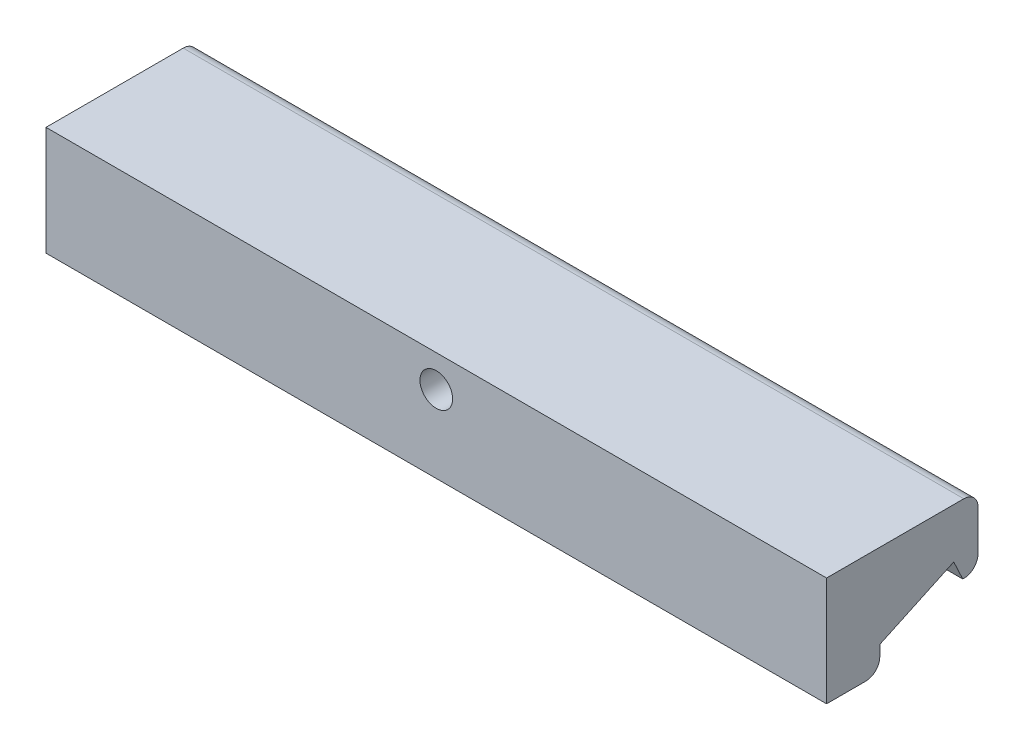
ISO-10303-21;
HEADER;
FILE_DESCRIPTION(('STEP AP214'),'2;1');
FILE_NAME('part.step','',(''),(''),'','','');
FILE_SCHEMA(('AUTOMOTIVE_DESIGN { 1 0 10303 214 1 1 1 1 }'));
ENDSEC;
DATA;
#1=APPLICATION_CONTEXT('core data for automotive mechanical design processes');
#2=APPLICATION_PROTOCOL_DEFINITION('international standard','automotive_design',2000,#1);
#3=PRODUCT_CONTEXT('',#1,'mechanical');
#4=PRODUCT('Part','Part','',(#3));
#5=PRODUCT_RELATED_PRODUCT_CATEGORY('part','',(#4));
#6=PRODUCT_DEFINITION_FORMATION('','',#4);
#7=PRODUCT_DEFINITION_CONTEXT('part definition',#1,'design');
#8=PRODUCT_DEFINITION('design','',#6,#7);
#9=PRODUCT_DEFINITION_SHAPE('','',#8);
#10=(LENGTH_UNIT() NAMED_UNIT(*) SI_UNIT(.MILLI.,.METRE.));
#11=(NAMED_UNIT(*) PLANE_ANGLE_UNIT() SI_UNIT($,.RADIAN.));
#12=(NAMED_UNIT(*) SI_UNIT($,.STERADIAN.) SOLID_ANGLE_UNIT());
#13=UNCERTAINTY_MEASURE_WITH_UNIT(LENGTH_MEASURE(1.E-05),#10,'distance_accuracy_value','');
#14=(GEOMETRIC_REPRESENTATION_CONTEXT(3) GLOBAL_UNCERTAINTY_ASSIGNED_CONTEXT((#13)) GLOBAL_UNIT_ASSIGNED_CONTEXT((#10,
#11,#12)) REPRESENTATION_CONTEXT('',''));
#15=CARTESIAN_POINT('',(0.,0.,0.));
#16=DIRECTION('',(0.,0.,1.));
#17=DIRECTION('',(1.,0.,0.));
#18=AXIS2_PLACEMENT_3D('',#15,#16,#17);
#19=CARTESIAN_POINT('',(110.,15.360110010018,0.));
#20=DIRECTION('',(0.,0.,-1.));
#21=DIRECTION('',(0.,1.,0.));
#22=AXIS2_PLACEMENT_3D('',#19,#20,#21);
#23=PLANE('',#22);
#24=CARTESIAN_POINT('',(55.,10.860110010018,0.));
#25=DIRECTION('',(0.,0.,1.));
#26=DIRECTION('',(1.,0.,0.));
#27=AXIS2_PLACEMENT_3D('',#24,#25,#26);
#28=CIRCLE('',#27,2.3);
#29=CARTESIAN_POINT('',(57.3,10.860110010018,0.));
#30=VERTEX_POINT('',#29);
#31=EDGE_CURVE('E213',#30,#30,#28,.T.);
#32=ORIENTED_EDGE('',*,*,#31,.F.);
#33=EDGE_LOOP('',(#32));
#34=FACE_BOUND('',#33,.T.);
#35=DIRECTION('',(0.,-1.,0.));
#36=VECTOR('',#35,1.);
#37=CARTESIAN_POINT('',(0.,15.360110010018,0.));
#38=LINE('',#37,#36);
#39=CARTESIAN_POINT('',(0.,15.360110010018,0.));
#40=VERTEX_POINT('',#39);
#41=CARTESIAN_POINT('',(0.,0.,0.));
#42=VERTEX_POINT('',#41);
#43=EDGE_CURVE('E147',#40,#42,#38,.T.);
#44=ORIENTED_EDGE('',*,*,#43,.T.);
#45=DIRECTION('',(-1.,0.,0.));
#46=VECTOR('',#45,1.);
#47=CARTESIAN_POINT('',(110.,0.,0.));
#48=LINE('',#47,#46);
#49=CARTESIAN_POINT('',(110.,0.,0.));
#50=VERTEX_POINT('',#49);
#51=EDGE_CURVE('E11',#50,#42,#48,.T.);
#52=ORIENTED_EDGE('',*,*,#51,.F.);
#53=DIRECTION('',(0.,-1.,0.));
#54=VECTOR('',#53,1.);
#55=CARTESIAN_POINT('',(110.,15.360110010018,0.));
#56=LINE('',#55,#54);
#57=CARTESIAN_POINT('',(110.,15.360110010018,0.));
#58=VERTEX_POINT('',#57);
#59=EDGE_CURVE('E166',#58,#50,#56,.T.);
#60=ORIENTED_EDGE('',*,*,#59,.F.);
#61=DIRECTION('',(-1.,0.,0.));
#62=VECTOR('',#61,1.);
#63=CARTESIAN_POINT('',(110.,15.360110010018,0.));
#64=LINE('',#63,#62);
#65=EDGE_CURVE('E143',#58,#40,#64,.T.);
#66=ORIENTED_EDGE('',*,*,#65,.T.);
#67=EDGE_LOOP('',(#44,#52,#60,#66));
#68=FACE_BOUND('',#67,.T.);
#69=ADVANCED_FACE('F39',(#34,#68),#23,.F.);
#70=CARTESIAN_POINT('',(110.,0.,0.));
#71=DIRECTION('',(0.,1.,0.));
#72=DIRECTION('',(0.,0.,1.));
#73=AXIS2_PLACEMENT_3D('',#70,#71,#72);
#74=PLANE('',#73);
#75=DIRECTION('',(0.,0.,-1.));
#76=VECTOR('',#75,1.);
#77=CARTESIAN_POINT('',(0.,0.,0.));
#78=LINE('',#77,#76);
#79=CARTESIAN_POINT('',(0.,0.,-5.4994615533352));
#80=VERTEX_POINT('',#79);
#81=EDGE_CURVE('E150',#42,#80,#78,.T.);
#82=ORIENTED_EDGE('',*,*,#81,.T.);
#83=DIRECTION('',(-1.,0.,0.));
#84=VECTOR('',#83,1.);
#85=CARTESIAN_POINT('',(110.,0.,-5.4994615533352));
#86=LINE('',#85,#84);
#87=CARTESIAN_POINT('',(110.,0.,-5.4994615533352));
#88=VERTEX_POINT('',#87);
#89=EDGE_CURVE('E47',#88,#80,#86,.T.);
#90=ORIENTED_EDGE('',*,*,#89,.F.);
#91=DIRECTION('',(0.,0.,-1.));
#92=VECTOR('',#91,1.);
#93=CARTESIAN_POINT('',(110.,0.,0.));
#94=LINE('',#93,#92);
#95=EDGE_CURVE('E104',#50,#88,#94,.T.);
#96=ORIENTED_EDGE('',*,*,#95,.F.);
#97=ORIENTED_EDGE('',*,*,#51,.T.);
#98=EDGE_LOOP('',(#82,#90,#96,#97));
#99=FACE_BOUND('',#98,.T.);
#100=ADVANCED_FACE('F229',(#99),#74,.F.);
#101=CARTESIAN_POINT('',(110.,2.0005384466648,-5.4994615533352));
#102=DIRECTION('',(-1.,0.,0.));
#103=DIRECTION('',(0.,0.,1.));
#104=AXIS2_PLACEMENT_3D('',#101,#102,#103);
#105=CYLINDRICAL_SURFACE('',#104,2.0005384466648);
#106=CARTESIAN_POINT('',(0.,2.0005384466648,-5.4994615533352));
#107=DIRECTION('',(1.,0.,0.));
#108=DIRECTION('',(0.,0.,-1.));
#109=AXIS2_PLACEMENT_3D('',#106,#107,#108);
#110=CIRCLE('',#109,2.0005384466648);
#111=CARTESIAN_POINT('',(0.,2.0005384466648,-7.5));
#112=VERTEX_POINT('',#111);
#113=EDGE_CURVE('E153',#80,#112,#110,.T.);
#114=ORIENTED_EDGE('',*,*,#113,.T.);
#115=DIRECTION('',(-1.,0.,0.));
#116=VECTOR('',#115,1.);
#117=CARTESIAN_POINT('',(110.,2.0005384466648,-7.5));
#118=LINE('',#117,#116);
#119=CARTESIAN_POINT('',(110.,2.0005384466648,-7.5));
#120=VERTEX_POINT('',#119);
#121=EDGE_CURVE('E179',#120,#112,#118,.T.);
#122=ORIENTED_EDGE('',*,*,#121,.F.);
#123=CARTESIAN_POINT('',(110.,2.0005384466648,-5.4994615533352));
#124=DIRECTION('',(1.,0.,0.));
#125=DIRECTION('',(0.,0.,-1.));
#126=AXIS2_PLACEMENT_3D('',#123,#124,#125);
#127=CIRCLE('',#126,2.0005384466648);
#128=EDGE_CURVE('E187',#88,#120,#127,.T.);
#129=ORIENTED_EDGE('',*,*,#128,.F.);
#130=ORIENTED_EDGE('',*,*,#89,.T.);
#131=EDGE_LOOP('',(#114,#122,#129,#130));
#132=FACE_BOUND('',#131,.T.);
#133=ADVANCED_FACE('F185',(#132),#105,.T.);
#134=CARTESIAN_POINT('',(110.,3.5,-7.5));
#135=DIRECTION('',(0.,0.,1.));
#136=DIRECTION('',(0.,-1.,0.));
#137=AXIS2_PLACEMENT_3D('',#134,#135,#136);
#138=PLANE('',#137);
#139=DIRECTION('',(0.,1.,0.));
#140=VECTOR('',#139,1.);
#141=CARTESIAN_POINT('',(0.,3.5,-7.5));
#142=LINE('',#141,#140);
#143=CARTESIAN_POINT('',(0.,3.5,-7.5));
#144=VERTEX_POINT('',#143);
#145=EDGE_CURVE('E155',#112,#144,#142,.T.);
#146=ORIENTED_EDGE('',*,*,#145,.T.);
#147=DIRECTION('',(-1.,0.,0.));
#148=VECTOR('',#147,1.);
#149=CARTESIAN_POINT('',(110.,3.5,-7.5));
#150=LINE('',#149,#148);
#151=CARTESIAN_POINT('',(110.,3.5,-7.5));
#152=VERTEX_POINT('',#151);
#153=EDGE_CURVE('E176',#152,#144,#150,.T.);
#154=ORIENTED_EDGE('',*,*,#153,.F.);
#155=DIRECTION('',(0.,1.,0.));
#156=VECTOR('',#155,1.);
#157=CARTESIAN_POINT('',(110.,3.5,-7.5));
#158=LINE('',#157,#156);
#159=EDGE_CURVE('E205',#120,#152,#158,.T.);
#160=ORIENTED_EDGE('',*,*,#159,.F.);
#161=ORIENTED_EDGE('',*,*,#121,.T.);
#162=EDGE_LOOP('',(#146,#154,#160,#161));
#163=FACE_BOUND('',#162,.T.);
#164=ADVANCED_FACE('F196',(#163),#138,.F.);
#165=CARTESIAN_POINT('',(110.,8.36011001001802,-17.9225395509215));
#166=DIRECTION('',(0.,0.906307787036651,0.422618261740697));
#167=DIRECTION('',(0.,-0.422618261740697,0.906307787036651));
#168=AXIS2_PLACEMENT_3D('',#165,#166,#167);
#169=PLANE('',#168);
#170=DIRECTION('',(0.,0.422618261740697,-0.906307787036651));
#171=VECTOR('',#170,1.);
#172=CARTESIAN_POINT('',(0.,8.36011001001802,-17.9225395509215));
#173=LINE('',#172,#171);
#174=CARTESIAN_POINT('',(0.,8.36011001001802,-17.9225395509215));
#175=VERTEX_POINT('',#174);
#176=EDGE_CURVE('E157',#144,#175,#173,.T.);
#177=ORIENTED_EDGE('',*,*,#176,.T.);
#178=DIRECTION('',(-1.,0.,0.));
#179=VECTOR('',#178,1.);
#180=CARTESIAN_POINT('',(110.,8.36011001001802,-17.9225395509215));
#181=LINE('',#180,#179);
#182=CARTESIAN_POINT('',(110.,8.36011001001802,-17.9225395509215));
#183=VERTEX_POINT('',#182);
#184=EDGE_CURVE('E173',#183,#175,#181,.T.);
#185=ORIENTED_EDGE('',*,*,#184,.F.);
#186=DIRECTION('',(0.,0.422618261740697,-0.906307787036651));
#187=VECTOR('',#186,1.);
#188=CARTESIAN_POINT('',(110.,8.36011001001802,-17.9225395509215));
#189=LINE('',#188,#187);
#190=EDGE_CURVE('E202',#152,#183,#189,.T.);
#191=ORIENTED_EDGE('',*,*,#190,.F.);
#192=ORIENTED_EDGE('',*,*,#153,.T.);
#193=EDGE_LOOP('',(#177,#185,#191,#192));
#194=FACE_BOUND('',#193,.T.);
#195=ADVANCED_FACE('F200',(#194),#169,.F.);
#196=CARTESIAN_POINT('',(110.,5.64118664890806,-19.1903943361436));
#197=DIRECTION('',(0.,0.422618261740697,-0.906307787036651));
#198=DIRECTION('',(0.,0.906307787036651,0.422618261740697));
#199=AXIS2_PLACEMENT_3D('',#196,#197,#198);
#200=PLANE('',#199);
#201=DIRECTION('',(0.,-0.906307787036651,-0.422618261740697));
#202=VECTOR('',#201,1.);
#203=CARTESIAN_POINT('',(0.,5.64118664890806,-19.1903943361436));
#204=LINE('',#203,#202);
#205=CARTESIAN_POINT('',(0.,5.64118664890806,-19.1903943361436));
#206=VERTEX_POINT('',#205);
#207=EDGE_CURVE('E159',#175,#206,#204,.T.);
#208=ORIENTED_EDGE('',*,*,#207,.T.);
#209=DIRECTION('',(-1.,0.,0.));
#210=VECTOR('',#209,1.);
#211=CARTESIAN_POINT('',(110.,5.64118664890806,-19.1903943361436));
#212=LINE('',#211,#210);
#213=CARTESIAN_POINT('',(110.,5.64118664890806,-19.1903943361436));
#214=VERTEX_POINT('',#213);
#215=EDGE_CURVE('E170',#214,#206,#212,.T.);
#216=ORIENTED_EDGE('',*,*,#215,.F.);
#217=DIRECTION('',(0.,-0.906307787036651,-0.422618261740697));
#218=VECTOR('',#217,1.);
#219=CARTESIAN_POINT('',(110.,5.64118664890806,-19.1903943361436));
#220=LINE('',#219,#218);
#221=EDGE_CURVE('E204',#183,#214,#220,.T.);
#222=ORIENTED_EDGE('',*,*,#221,.F.);
#223=ORIENTED_EDGE('',*,*,#184,.T.);
#224=EDGE_LOOP('',(#208,#216,#222,#223));
#225=FACE_BOUND('',#224,.T.);
#226=ADVANCED_FACE('F237',(#225),#200,.F.);
#227=CARTESIAN_POINT('',(110.,7.63552847711335,-19.3407295358501));
#228=DIRECTION('',(-1.,0.,0.));
#229=DIRECTION('',(0.,0.,1.));
#230=AXIS2_PLACEMENT_3D('',#227,#228,#229);
#231=CYLINDRICAL_SURFACE('',#230,2.);
#232=CARTESIAN_POINT('',(0.,7.63552847711335,-19.3407295358501));
#233=DIRECTION('',(1.,0.,0.));
#234=DIRECTION('',(0.,0.,-1.));
#235=AXIS2_PLACEMENT_3D('',#232,#233,#234);
#236=CIRCLE('',#235,2.);
#237=CARTESIAN_POINT('',(0.,7.63552847711335,-21.3407295358501));
#238=VERTEX_POINT('',#237);
#239=EDGE_CURVE('E161',#206,#238,#236,.T.);
#240=ORIENTED_EDGE('',*,*,#239,.T.);
#241=DIRECTION('',(-1.,0.,0.));
#242=VECTOR('',#241,1.);
#243=CARTESIAN_POINT('',(110.,7.63552847711335,-21.3407295358501));
#244=LINE('',#243,#242);
#245=CARTESIAN_POINT('',(110.,7.63552847711335,-21.3407295358501));
#246=VERTEX_POINT('',#245);
#247=EDGE_CURVE('E138',#246,#238,#244,.T.);
#248=ORIENTED_EDGE('',*,*,#247,.F.);
#249=CARTESIAN_POINT('',(110.,7.63552847711335,-19.3407295358501));
#250=DIRECTION('',(1.,0.,0.));
#251=DIRECTION('',(0.,0.,-1.));
#252=AXIS2_PLACEMENT_3D('',#249,#250,#251);
#253=CIRCLE('',#252,2.);
#254=EDGE_CURVE('E129',#214,#246,#253,.T.);
#255=ORIENTED_EDGE('',*,*,#254,.F.);
#256=ORIENTED_EDGE('',*,*,#215,.T.);
#257=EDGE_LOOP('',(#240,#248,#255,#256));
#258=FACE_BOUND('',#257,.T.);
#259=ADVANCED_FACE('F234',(#258),#231,.T.);
#260=CARTESIAN_POINT('',(110.,7.63552847711335,-21.3407295358501));
#261=DIRECTION('',(0.,0.,1.));
#262=DIRECTION('',(1.,0.,0.));
#263=AXIS2_PLACEMENT_3D('',#260,#261,#262);
#264=PLANE('',#263);
#265=DIRECTION('',(0.,1.,0.));
#266=VECTOR('',#265,1.);
#267=CARTESIAN_POINT('',(0.,7.63552847711335,-21.3407295358501));
#268=LINE('',#267,#266);
#269=CARTESIAN_POINT('',(0.,13.360110010018,-21.3407295358501));
#270=VERTEX_POINT('',#269);
#271=EDGE_CURVE('E137',#238,#270,#268,.T.);
#272=ORIENTED_EDGE('',*,*,#271,.T.);
#273=DIRECTION('',(-1.,0.,0.));
#274=VECTOR('',#273,1.);
#275=CARTESIAN_POINT('',(110.,13.360110010018,-21.3407295358501));
#276=LINE('',#275,#274);
#277=CARTESIAN_POINT('',(110.,13.360110010018,-21.3407295358501));
#278=VERTEX_POINT('',#277);
#279=EDGE_CURVE('E134',#278,#270,#276,.T.);
#280=ORIENTED_EDGE('',*,*,#279,.F.);
#281=DIRECTION('',(0.,1.,0.));
#282=VECTOR('',#281,1.);
#283=CARTESIAN_POINT('',(110.,7.63552847711335,-21.3407295358501));
#284=LINE('',#283,#282);
#285=EDGE_CURVE('E123',#246,#278,#284,.T.);
#286=ORIENTED_EDGE('',*,*,#285,.F.);
#287=ORIENTED_EDGE('',*,*,#247,.T.);
#288=EDGE_LOOP('',(#272,#280,#286,#287));
#289=FACE_BOUND('',#288,.T.);
#290=ADVANCED_FACE('F135',(#289),#264,.F.);
#291=CARTESIAN_POINT('',(110.,13.360110010018,-19.3407295358501));
#292=DIRECTION('',(-1.,0.,0.));
#293=DIRECTION('',(0.,0.,1.));
#294=AXIS2_PLACEMENT_3D('',#291,#292,#293);
#295=CYLINDRICAL_SURFACE('',#294,2.);
#296=CARTESIAN_POINT('',(0.,13.360110010018,-19.3407295358501));
#297=DIRECTION('',(1.,0.,0.));
#298=DIRECTION('',(0.,0.,1.));
#299=AXIS2_PLACEMENT_3D('',#296,#297,#298);
#300=CIRCLE('',#299,2.);
#301=CARTESIAN_POINT('',(0.,15.360110010018,-19.3407295358501));
#302=VERTEX_POINT('',#301);
#303=EDGE_CURVE('E90',#270,#302,#300,.T.);
#304=ORIENTED_EDGE('',*,*,#303,.T.);
#305=DIRECTION('',(-1.,0.,0.));
#306=VECTOR('',#305,1.);
#307=CARTESIAN_POINT('',(110.,15.360110010018,-19.3407295358501));
#308=LINE('',#307,#306);
#309=CARTESIAN_POINT('',(110.,15.360110010018,-19.3407295358501));
#310=VERTEX_POINT('',#309);
#311=EDGE_CURVE('E139',#310,#302,#308,.T.);
#312=ORIENTED_EDGE('',*,*,#311,.F.);
#313=CARTESIAN_POINT('',(110.,13.360110010018,-19.3407295358501));
#314=DIRECTION('',(1.,0.,0.));
#315=DIRECTION('',(0.,0.,1.));
#316=AXIS2_PLACEMENT_3D('',#313,#314,#315);
#317=CIRCLE('',#316,2.);
#318=EDGE_CURVE('E127',#278,#310,#317,.T.);
#319=ORIENTED_EDGE('',*,*,#318,.F.);
#320=ORIENTED_EDGE('',*,*,#279,.T.);
#321=EDGE_LOOP('',(#304,#312,#319,#320));
#322=FACE_BOUND('',#321,.T.);
#323=ADVANCED_FACE('F141',(#322),#295,.T.);
#324=CARTESIAN_POINT('',(110.,15.360110010018,-19.3407295358501));
#325=DIRECTION('',(0.,-1.,0.));
#326=DIRECTION('',(0.,0.,-1.));
#327=AXIS2_PLACEMENT_3D('',#324,#325,#326);
#328=PLANE('',#327);
#329=DIRECTION('',(0.,0.,1.));
#330=VECTOR('',#329,1.);
#331=CARTESIAN_POINT('',(0.,15.360110010018,-19.3407295358501));
#332=LINE('',#331,#330);
#333=EDGE_CURVE('E96',#302,#40,#332,.T.);
#334=ORIENTED_EDGE('',*,*,#333,.T.);
#335=ORIENTED_EDGE('',*,*,#65,.F.);
#336=DIRECTION('',(0.,0.,1.));
#337=VECTOR('',#336,1.);
#338=CARTESIAN_POINT('',(110.,15.360110010018,-19.3407295358501));
#339=LINE('',#338,#337);
#340=EDGE_CURVE('E55',#310,#58,#339,.T.);
#341=ORIENTED_EDGE('',*,*,#340,.F.);
#342=ORIENTED_EDGE('',*,*,#311,.T.);
#343=EDGE_LOOP('',(#334,#335,#341,#342));
#344=FACE_BOUND('',#343,.T.);
#345=ADVANCED_FACE('F297',(#344),#328,.F.);
#346=CARTESIAN_POINT('',(110.,2.0005384466648,-5.4994615533352));
#347=DIRECTION('',(1.,0.,0.));
#348=DIRECTION('',(0.,0.,-1.));
#349=AXIS2_PLACEMENT_3D('',#346,#347,#348);
#350=PLANE('',#349);
#351=ORIENTED_EDGE('',*,*,#59,.T.);
#352=ORIENTED_EDGE('',*,*,#95,.T.);
#353=ORIENTED_EDGE('',*,*,#128,.T.);
#354=ORIENTED_EDGE('',*,*,#159,.T.);
#355=ORIENTED_EDGE('',*,*,#190,.T.);
#356=ORIENTED_EDGE('',*,*,#221,.T.);
#357=ORIENTED_EDGE('',*,*,#254,.T.);
#358=ORIENTED_EDGE('',*,*,#285,.T.);
#359=ORIENTED_EDGE('',*,*,#318,.T.);
#360=ORIENTED_EDGE('',*,*,#340,.T.);
#361=EDGE_LOOP('',(#351,#352,#353,#354,#355,#356,#357,#358,#359,#360));
#362=FACE_BOUND('',#361,.T.);
#363=ADVANCED_FACE('F125',(#362),#350,.T.);
#364=CARTESIAN_POINT('',(0.,2.0005384466648,-5.4994615533352));
#365=DIRECTION('',(1.,0.,0.));
#366=DIRECTION('',(0.,0.,-1.));
#367=AXIS2_PLACEMENT_3D('',#364,#365,#366);
#368=PLANE('',#367);
#369=ORIENTED_EDGE('',*,*,#43,.F.);
#370=ORIENTED_EDGE('',*,*,#333,.F.);
#371=ORIENTED_EDGE('',*,*,#303,.F.);
#372=ORIENTED_EDGE('',*,*,#271,.F.);
#373=ORIENTED_EDGE('',*,*,#239,.F.);
#374=ORIENTED_EDGE('',*,*,#207,.F.);
#375=ORIENTED_EDGE('',*,*,#176,.F.);
#376=ORIENTED_EDGE('',*,*,#145,.F.);
#377=ORIENTED_EDGE('',*,*,#113,.F.);
#378=ORIENTED_EDGE('',*,*,#81,.F.);
#379=EDGE_LOOP('',(#369,#370,#371,#372,#373,#374,#375,#376,#377,#378));
#380=FACE_BOUND('',#379,.T.);
#381=ADVANCED_FACE('F191',(#380),#368,.F.);
#382=CARTESIAN_POINT('',(55.,10.860110010018,-4.5));
#383=DIRECTION('',(0.,0.,1.));
#384=DIRECTION('',(1.,0.,0.));
#385=AXIS2_PLACEMENT_3D('',#382,#383,#384);
#386=CYLINDRICAL_SURFACE('',#385,2.3);
#387=CARTESIAN_POINT('',(55.,10.860110010018,-4.5));
#388=DIRECTION('',(0.,0.,1.));
#389=DIRECTION('',(1.,0.,0.));
#390=AXIS2_PLACEMENT_3D('',#387,#388,#389);
#391=CIRCLE('',#390,2.3);
#392=CARTESIAN_POINT('',(57.3,10.860110010018,-4.5));
#393=VERTEX_POINT('',#392);
#394=EDGE_CURVE('E151',#393,#393,#391,.T.);
#395=ORIENTED_EDGE('',*,*,#394,.F.);
#396=EDGE_LOOP('',(#395));
#397=FACE_BOUND('',#396,.T.);
#398=ORIENTED_EDGE('',*,*,#31,.T.);
#399=EDGE_LOOP('',(#398));
#400=FACE_BOUND('',#399,.T.);
#401=ADVANCED_FACE('F221',(#397,#400),#386,.F.);
#402=CARTESIAN_POINT('',(55.,10.860110010018,-4.5));
#403=DIRECTION('',(0.,0.,1.));
#404=DIRECTION('',(1.,0.,0.));
#405=AXIS2_PLACEMENT_3D('',#402,#403,#404);
#406=PLANE('',#405);
#407=ORIENTED_EDGE('',*,*,#394,.T.);
#408=EDGE_LOOP('',(#407));
#409=FACE_BOUND('',#408,.T.);
#410=ADVANCED_FACE('F219',(#409),#406,.T.);
#411=CLOSED_SHELL('',(#69,#100,#133,#164,#195,#226,#259,#290,#323,#345,#363,#381,#401,#410));
#412=MANIFOLD_SOLID_BREP('B2',#411);
#413=ADVANCED_BREP_SHAPE_REPRESENTATION('',(#18,#412),#14);
#414=SHAPE_DEFINITION_REPRESENTATION(#9,#413);
ENDSEC;
END-ISO-10303-21;
